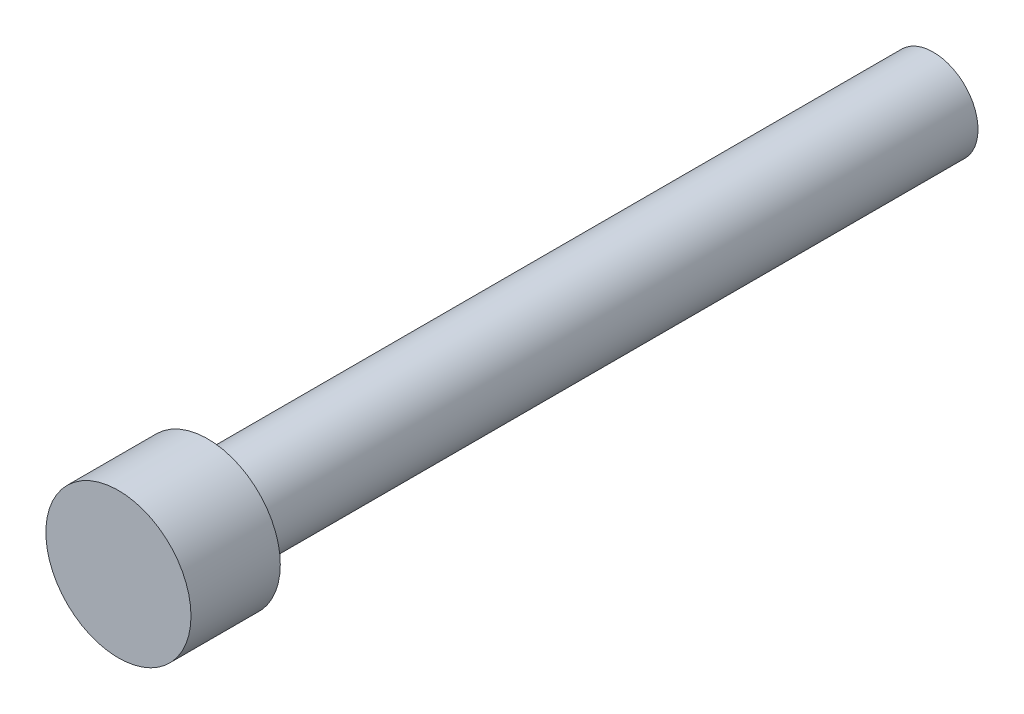
ISO-10303-21;
HEADER;
FILE_DESCRIPTION(('STEP AP214'),'2;1');
FILE_NAME('part.step','',(''),(''),'','','');
FILE_SCHEMA(('AUTOMOTIVE_DESIGN { 1 0 10303 214 1 1 1 1 }'));
ENDSEC;
DATA;
#1=APPLICATION_CONTEXT('core data for automotive mechanical design processes');
#2=APPLICATION_PROTOCOL_DEFINITION('international standard','automotive_design',2000,#1);
#3=PRODUCT_CONTEXT('',#1,'mechanical');
#4=PRODUCT('Part','Part','',(#3));
#5=PRODUCT_RELATED_PRODUCT_CATEGORY('part','',(#4));
#6=PRODUCT_DEFINITION_FORMATION('','',#4);
#7=PRODUCT_DEFINITION_CONTEXT('part definition',#1,'design');
#8=PRODUCT_DEFINITION('design','',#6,#7);
#9=PRODUCT_DEFINITION_SHAPE('','',#8);
#10=(LENGTH_UNIT() NAMED_UNIT(*) SI_UNIT(.MILLI.,.METRE.));
#11=(NAMED_UNIT(*) PLANE_ANGLE_UNIT() SI_UNIT($,.RADIAN.));
#12=(NAMED_UNIT(*) SI_UNIT($,.STERADIAN.) SOLID_ANGLE_UNIT());
#13=UNCERTAINTY_MEASURE_WITH_UNIT(LENGTH_MEASURE(1.E-05),#10,'distance_accuracy_value','');
#14=(GEOMETRIC_REPRESENTATION_CONTEXT(3) GLOBAL_UNCERTAINTY_ASSIGNED_CONTEXT((#13)) GLOBAL_UNIT_ASSIGNED_CONTEXT((#10,
#11,#12)) REPRESENTATION_CONTEXT('',''));
#15=CARTESIAN_POINT('',(0.,0.,0.));
#16=DIRECTION('',(0.,0.,1.));
#17=DIRECTION('',(1.,0.,0.));
#18=AXIS2_PLACEMENT_3D('',#15,#16,#17);
#19=CARTESIAN_POINT('',(0.,0.,65.));
#20=DIRECTION('',(0.,0.,-1.));
#21=DIRECTION('',(-1.,0.,0.));
#22=AXIS2_PLACEMENT_3D('',#19,#20,#21);
#23=CYLINDRICAL_SURFACE('',#22,4.);
#24=CARTESIAN_POINT('',(0.,0.,65.));
#25=DIRECTION('',(0.,0.,1.));
#26=DIRECTION('',(1.,0.,0.));
#27=AXIS2_PLACEMENT_3D('',#24,#25,#26);
#28=CIRCLE('',#27,4.);
#29=CARTESIAN_POINT('',(4.,0.,65.));
#30=VERTEX_POINT('',#29);
#31=EDGE_CURVE('E10',#30,#30,#28,.T.);
#32=ORIENTED_EDGE('',*,*,#31,.F.);
#33=EDGE_LOOP('',(#32));
#34=FACE_BOUND('',#33,.T.);
#35=CARTESIAN_POINT('',(0.,0.,0.));
#36=DIRECTION('',(0.,0.,1.));
#37=DIRECTION('',(1.,0.,0.));
#38=AXIS2_PLACEMENT_3D('',#35,#36,#37);
#39=CIRCLE('',#38,4.);
#40=CARTESIAN_POINT('',(4.,0.,0.));
#41=VERTEX_POINT('',#40);
#42=EDGE_CURVE('E40',#41,#41,#39,.T.);
#43=ORIENTED_EDGE('',*,*,#42,.T.);
#44=EDGE_LOOP('',(#43));
#45=FACE_BOUND('',#44,.T.);
#46=ADVANCED_FACE('F37',(#34,#45),#23,.T.);
#47=CARTESIAN_POINT('',(0.,0.,0.));
#48=DIRECTION('',(0.,0.,1.));
#49=DIRECTION('',(1.,0.,0.));
#50=AXIS2_PLACEMENT_3D('',#47,#48,#49);
#51=PLANE('',#50);
#52=ORIENTED_EDGE('',*,*,#42,.F.);
#53=EDGE_LOOP('',(#52));
#54=FACE_BOUND('',#53,.T.);
#55=ADVANCED_FACE('F60',(#54),#51,.F.);
#56=CARTESIAN_POINT('',(0.,0.,73.));
#57=DIRECTION('',(0.,0.,-1.));
#58=DIRECTION('',(-1.,0.,0.));
#59=AXIS2_PLACEMENT_3D('',#56,#57,#58);
#60=CYLINDRICAL_SURFACE('',#59,6.5);
#61=CARTESIAN_POINT('',(0.,0.,73.));
#62=DIRECTION('',(0.,0.,1.));
#63=DIRECTION('',(1.,0.,0.));
#64=AXIS2_PLACEMENT_3D('',#61,#62,#63);
#65=CIRCLE('',#64,6.5);
#66=CARTESIAN_POINT('',(6.5,0.,73.));
#67=VERTEX_POINT('',#66);
#68=EDGE_CURVE('E47',#67,#67,#65,.T.);
#69=ORIENTED_EDGE('',*,*,#68,.F.);
#70=EDGE_LOOP('',(#69));
#71=FACE_BOUND('',#70,.T.);
#72=CARTESIAN_POINT('',(0.,0.,65.));
#73=DIRECTION('',(0.,0.,1.));
#74=DIRECTION('',(1.,0.,0.));
#75=AXIS2_PLACEMENT_3D('',#72,#73,#74);
#76=CIRCLE('',#75,6.5);
#77=CARTESIAN_POINT('',(6.5,0.,65.));
#78=VERTEX_POINT('',#77);
#79=EDGE_CURVE('E49',#78,#78,#76,.T.);
#80=ORIENTED_EDGE('',*,*,#79,.T.);
#81=EDGE_LOOP('',(#80));
#82=FACE_BOUND('',#81,.T.);
#83=ADVANCED_FACE('F57',(#71,#82),#60,.T.);
#84=CARTESIAN_POINT('',(0.,0.,73.));
#85=DIRECTION('',(0.,0.,1.));
#86=DIRECTION('',(1.,0.,0.));
#87=AXIS2_PLACEMENT_3D('',#84,#85,#86);
#88=PLANE('',#87);
#89=ORIENTED_EDGE('',*,*,#68,.T.);
#90=EDGE_LOOP('',(#89));
#91=FACE_BOUND('',#90,.T.);
#92=ADVANCED_FACE('F55',(#91),#88,.T.);
#93=CARTESIAN_POINT('',(0.,0.,65.));
#94=DIRECTION('',(0.,0.,1.));
#95=DIRECTION('',(1.,0.,0.));
#96=AXIS2_PLACEMENT_3D('',#93,#94,#95);
#97=PLANE('',#96);
#98=ORIENTED_EDGE('',*,*,#31,.T.);
#99=EDGE_LOOP('',(#98));
#100=FACE_BOUND('',#99,.T.);
#101=ORIENTED_EDGE('',*,*,#79,.F.);
#102=EDGE_LOOP('',(#101));
#103=FACE_BOUND('',#102,.T.);
#104=ADVANCED_FACE('F64',(#100,#103),#97,.F.);
#105=CLOSED_SHELL('',(#46,#55,#83,#92,#104));
#106=MANIFOLD_SOLID_BREP('B2',#105);
#107=ADVANCED_BREP_SHAPE_REPRESENTATION('',(#18,#106),#14);
#108=SHAPE_DEFINITION_REPRESENTATION(#9,#107);
ENDSEC;
END-ISO-10303-21;
